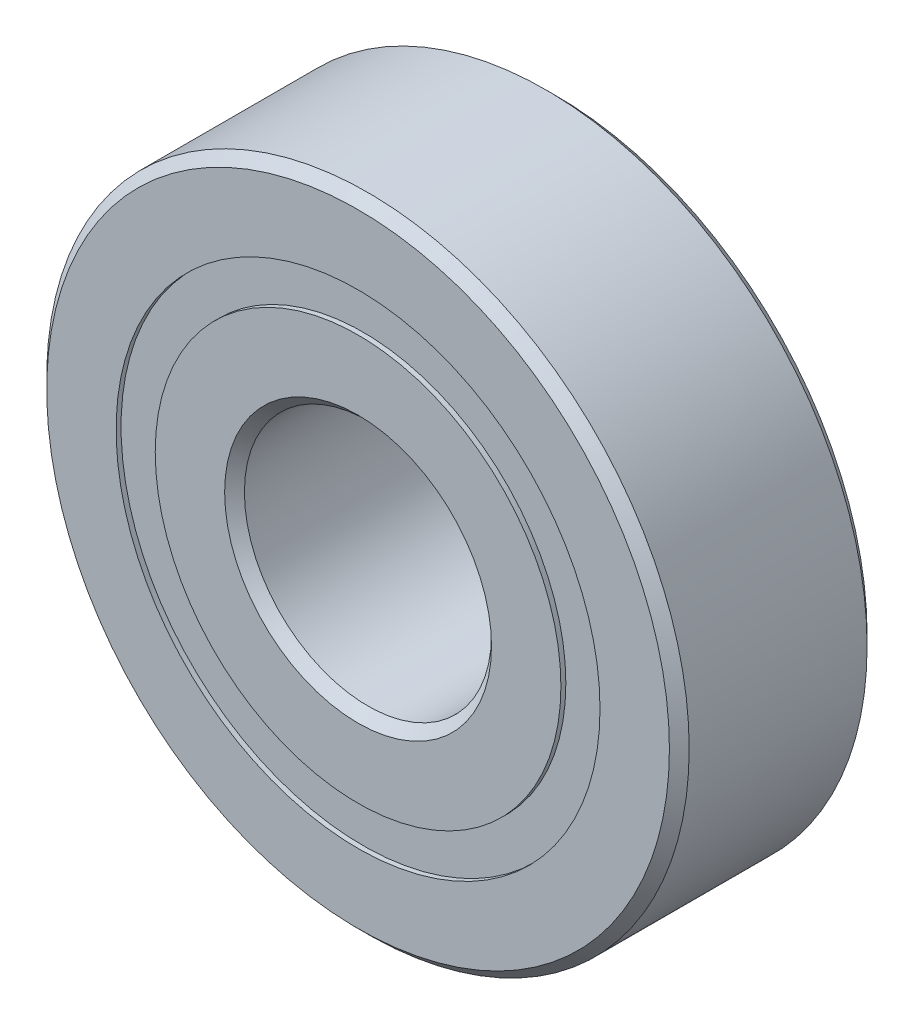
ISO-10303-21;
HEADER;
FILE_DESCRIPTION(('STEP AP214'),'2;1');
FILE_NAME('part.step','',(''),(''),'','','');
FILE_SCHEMA(('AUTOMOTIVE_DESIGN { 1 0 10303 214 1 1 1 1 }'));
ENDSEC;
DATA;
#1=APPLICATION_CONTEXT('core data for automotive mechanical design processes');
#2=APPLICATION_PROTOCOL_DEFINITION('international standard','automotive_design',2000,#1);
#3=PRODUCT_CONTEXT('',#1,'mechanical');
#4=PRODUCT('Part','Part','',(#3));
#5=PRODUCT_RELATED_PRODUCT_CATEGORY('part','',(#4));
#6=PRODUCT_DEFINITION_FORMATION('','',#4);
#7=PRODUCT_DEFINITION_CONTEXT('part definition',#1,'design');
#8=PRODUCT_DEFINITION('design','',#6,#7);
#9=PRODUCT_DEFINITION_SHAPE('','',#8);
#10=(LENGTH_UNIT() NAMED_UNIT(*) SI_UNIT(.MILLI.,.METRE.));
#11=(NAMED_UNIT(*) PLANE_ANGLE_UNIT() SI_UNIT($,.RADIAN.));
#12=(NAMED_UNIT(*) SI_UNIT($,.STERADIAN.) SOLID_ANGLE_UNIT());
#13=UNCERTAINTY_MEASURE_WITH_UNIT(LENGTH_MEASURE(1.E-05),#10,'distance_accuracy_value','');
#14=(GEOMETRIC_REPRESENTATION_CONTEXT(3) GLOBAL_UNCERTAINTY_ASSIGNED_CONTEXT((#13)) GLOBAL_UNIT_ASSIGNED_CONTEXT((#10,
#11,#12)) REPRESENTATION_CONTEXT('',''));
#15=CARTESIAN_POINT('',(0.,0.,0.));
#16=DIRECTION('',(0.,0.,1.));
#17=DIRECTION('',(1.,0.,0.));
#18=AXIS2_PLACEMENT_3D('',#15,#16,#17);
#19=CARTESIAN_POINT('',(0.,9.79120879120879,-3.80000000000003));
#20=DIRECTION('',(0.,0.,1.));
#21=DIRECTION('',(1.,0.,0.));
#22=AXIS2_PLACEMENT_3D('',#19,#20,#21);
#23=PLANE('',#22);
#24=CARTESIAN_POINT('',(0.,0.,-3.80000000000003));
#25=DIRECTION('',(0.,0.,1.));
#26=DIRECTION('',(1.,0.,0.));
#27=AXIS2_PLACEMENT_3D('',#24,#25,#26);
#28=CIRCLE('',#27,9.79120879120879);
#29=CARTESIAN_POINT('',(9.79120879120879,0.,-3.80000000000003));
#30=VERTEX_POINT('',#29);
#31=EDGE_CURVE('E55',#30,#30,#28,.T.);
#32=ORIENTED_EDGE('',*,*,#31,.F.);
#33=EDGE_LOOP('',(#32));
#34=FACE_BOUND('',#33,.T.);
#35=CARTESIAN_POINT('',(0.,0.,-3.80000000000003));
#36=DIRECTION('',(0.,0.,1.));
#37=DIRECTION('',(1.,0.,0.));
#38=AXIS2_PLACEMENT_3D('',#35,#36,#37);
#39=CIRCLE('',#38,8.20879120879121);
#40=CARTESIAN_POINT('',(8.20879120879121,0.,-3.80000000000003));
#41=VERTEX_POINT('',#40);
#42=EDGE_CURVE('E11',#41,#41,#39,.T.);
#43=ORIENTED_EDGE('',*,*,#42,.T.);
#44=EDGE_LOOP('',(#43));
#45=FACE_BOUND('',#44,.T.);
#46=ADVANCED_FACE('F41',(#34,#45),#23,.F.);
#47=CARTESIAN_POINT('',(0.,0.,4.));
#48=DIRECTION('',(0.,0.,1.));
#49=DIRECTION('',(1.,0.,0.));
#50=AXIS2_PLACEMENT_3D('',#47,#48,#49);
#51=CYLINDRICAL_SURFACE('',#50,8.20879120879121);
#52=ORIENTED_EDGE('',*,*,#42,.F.);
#53=EDGE_LOOP('',(#52));
#54=FACE_BOUND('',#53,.T.);
#55=CARTESIAN_POINT('',(0.,0.,-1.9458944417533));
#56=DIRECTION('',(0.,0.,1.));
#57=DIRECTION('',(1.,0.,0.));
#58=AXIS2_PLACEMENT_3D('',#55,#56,#57);
#59=CIRCLE('',#58,8.20879120879121);
#60=CARTESIAN_POINT('',(8.20879120879121,0.,-1.9458944417533));
#61=VERTEX_POINT('',#60);
#62=EDGE_CURVE('E47',#61,#61,#59,.T.);
#63=ORIENTED_EDGE('',*,*,#62,.T.);
#64=EDGE_LOOP('',(#63));
#65=FACE_BOUND('',#64,.T.);
#66=ADVANCED_FACE('F64',(#54,#65),#51,.F.);
#67=CARTESIAN_POINT('',(0.,9.79120879120879,-1.9458944417533));
#68=DIRECTION('',(0.,0.,-1.));
#69=DIRECTION('',(-1.,0.,0.));
#70=AXIS2_PLACEMENT_3D('',#67,#68,#69);
#71=PLANE('',#70);
#72=ORIENTED_EDGE('',*,*,#62,.F.);
#73=EDGE_LOOP('',(#72));
#74=FACE_BOUND('',#73,.T.);
#75=CARTESIAN_POINT('',(0.,0.,-1.9458944417533));
#76=DIRECTION('',(0.,0.,1.));
#77=DIRECTION('',(1.,0.,0.));
#78=AXIS2_PLACEMENT_3D('',#75,#76,#77);
#79=CIRCLE('',#78,9.79120879120879);
#80=CARTESIAN_POINT('',(9.79120879120879,0.,-1.9458944417533));
#81=VERTEX_POINT('',#80);
#82=EDGE_CURVE('E51',#81,#81,#79,.T.);
#83=ORIENTED_EDGE('',*,*,#82,.T.);
#84=EDGE_LOOP('',(#83));
#85=FACE_BOUND('',#84,.T.);
#86=ADVANCED_FACE('F68',(#74,#85),#71,.F.);
#87=CARTESIAN_POINT('',(0.,0.,4.));
#88=DIRECTION('',(0.,0.,1.));
#89=DIRECTION('',(1.,0.,0.));
#90=AXIS2_PLACEMENT_3D('',#87,#88,#89);
#91=CYLINDRICAL_SURFACE('',#90,9.79120879120879);
#92=ORIENTED_EDGE('',*,*,#82,.F.);
#93=EDGE_LOOP('',(#92));
#94=FACE_BOUND('',#93,.T.);
#95=ORIENTED_EDGE('',*,*,#31,.T.);
#96=EDGE_LOOP('',(#95));
#97=FACE_BOUND('',#96,.T.);
#98=ADVANCED_FACE('F61',(#94,#97),#91,.T.);
#99=CLOSED_SHELL('',(#46,#66,#86,#98));
#100=MANIFOLD_SOLID_BREP('B2',#99);
#101=CARTESIAN_POINT('',(0.,9.79120879120877,3.80000000000003));
#102=DIRECTION('',(0.,0.,-1.));
#103=DIRECTION('',(-1.,0.,0.));
#104=AXIS2_PLACEMENT_3D('',#101,#102,#103);
#105=PLANE('',#104);
#106=CARTESIAN_POINT('',(0.,0.,3.80000000000003));
#107=DIRECTION('',(0.,0.,1.));
#108=DIRECTION('',(1.,0.,0.));
#109=AXIS2_PLACEMENT_3D('',#106,#107,#108);
#110=CIRCLE('',#109,8.20879120879121);
#111=CARTESIAN_POINT('',(8.20879120879121,0.,3.80000000000003));
#112=VERTEX_POINT('',#111);
#113=EDGE_CURVE('E40',#112,#112,#110,.T.);
#114=ORIENTED_EDGE('',*,*,#113,.F.);
#115=EDGE_LOOP('',(#114));
#116=FACE_BOUND('',#115,.T.);
#117=CARTESIAN_POINT('',(0.,0.,3.80000000000003));
#118=DIRECTION('',(0.,0.,1.));
#119=DIRECTION('',(1.,0.,0.));
#120=AXIS2_PLACEMENT_3D('',#117,#118,#119);
#121=CIRCLE('',#120,9.79120879120879);
#122=CARTESIAN_POINT('',(9.79120879120879,0.,3.80000000000003));
#123=VERTEX_POINT('',#122);
#124=EDGE_CURVE('E114',#123,#123,#121,.T.);
#125=ORIENTED_EDGE('',*,*,#124,.T.);
#126=EDGE_LOOP('',(#125));
#127=FACE_BOUND('',#126,.T.);
#128=ADVANCED_FACE('F100',(#116,#127),#105,.F.);
#129=CARTESIAN_POINT('',(0.,0.,4.));
#130=DIRECTION('',(0.,0.,1.));
#131=DIRECTION('',(1.,0.,0.));
#132=AXIS2_PLACEMENT_3D('',#129,#130,#131);
#133=CYLINDRICAL_SURFACE('',#132,8.20879120879121);
#134=CARTESIAN_POINT('',(0.,0.,1.9458944417533));
#135=DIRECTION('',(0.,0.,1.));
#136=DIRECTION('',(1.,0.,0.));
#137=AXIS2_PLACEMENT_3D('',#134,#135,#136);
#138=CIRCLE('',#137,8.20879120879121);
#139=CARTESIAN_POINT('',(8.20879120879121,0.,1.9458944417533));
#140=VERTEX_POINT('',#139);
#141=EDGE_CURVE('E106',#140,#140,#138,.T.);
#142=ORIENTED_EDGE('',*,*,#141,.F.);
#143=EDGE_LOOP('',(#142));
#144=FACE_BOUND('',#143,.T.);
#145=ORIENTED_EDGE('',*,*,#113,.T.);
#146=EDGE_LOOP('',(#145));
#147=FACE_BOUND('',#146,.T.);
#148=ADVANCED_FACE('F129',(#144,#147),#133,.F.);
#149=CARTESIAN_POINT('',(0.,9.79120879120879,1.94589444175342));
#150=DIRECTION('',(0.,0.,1.));
#151=DIRECTION('',(1.,0.,0.));
#152=AXIS2_PLACEMENT_3D('',#149,#150,#151);
#153=PLANE('',#152);
#154=CARTESIAN_POINT('',(0.,0.,1.9458944417533));
#155=DIRECTION('',(0.,0.,1.));
#156=DIRECTION('',(1.,0.,0.));
#157=AXIS2_PLACEMENT_3D('',#154,#155,#156);
#158=CIRCLE('',#157,9.79120879120879);
#159=CARTESIAN_POINT('',(9.79120879120879,0.,1.9458944417533));
#160=VERTEX_POINT('',#159);
#161=EDGE_CURVE('E110',#160,#160,#158,.T.);
#162=ORIENTED_EDGE('',*,*,#161,.F.);
#163=EDGE_LOOP('',(#162));
#164=FACE_BOUND('',#163,.T.);
#165=ORIENTED_EDGE('',*,*,#141,.T.);
#166=EDGE_LOOP('',(#165));
#167=FACE_BOUND('',#166,.T.);
#168=ADVANCED_FACE('F124',(#164,#167),#153,.F.);
#169=CARTESIAN_POINT('',(0.,0.,4.));
#170=DIRECTION('',(0.,0.,1.));
#171=DIRECTION('',(1.,0.,0.));
#172=AXIS2_PLACEMENT_3D('',#169,#170,#171);
#173=CYLINDRICAL_SURFACE('',#172,9.79120879120879);
#174=ORIENTED_EDGE('',*,*,#124,.F.);
#175=EDGE_LOOP('',(#174));
#176=FACE_BOUND('',#175,.T.);
#177=ORIENTED_EDGE('',*,*,#161,.T.);
#178=EDGE_LOOP('',(#177));
#179=FACE_BOUND('',#178,.T.);
#180=ADVANCED_FACE('F121',(#176,#179),#173,.T.);
#181=CLOSED_SHELL('',(#128,#148,#168,#180));
#182=MANIFOLD_SOLID_BREP('B6',#181);
#183=CARTESIAN_POINT('',(-3.90495365205792,8.10871981112182,0.));
#184=DIRECTION('',(0.,0.,1.));
#185=DIRECTION('',(-0.433883739117546,0.900968867902425,0.));
#186=AXIS2_PLACEMENT_3D('',#183,#184,#185);
#187=SPHERICAL_SURFACE('',#186,1.94589444175335);
#188=CARTESIAN_POINT('',(-3.90495365205792,8.10871981112182,1.94589444175335));
#189=VERTEX_POINT('',#188);
#190=VERTEX_LOOP('',#189);
#191=FACE_BOUND('',#190,.T.);
#192=ADVANCED_FACE('F159',(#191),#187,.T.);
#193=CLOSED_SHELL('',(#192));
#194=MANIFOLD_SOLID_BREP('B35',#193);
#195=CARTESIAN_POINT('',(-7.0364833422122,5.61140821672869,0.));
#196=DIRECTION('',(0.,0.,1.));
#197=DIRECTION('',(-0.781831482468022,0.623489801858743,0.));
#198=AXIS2_PLACEMENT_3D('',#195,#196,#197);
#199=SPHERICAL_SURFACE('',#198,1.94589444175335);
#200=CARTESIAN_POINT('',(-7.0364833422122,5.61140821672869,1.94589444175335));
#201=VERTEX_POINT('',#200);
#202=VERTEX_LOOP('',#201);
#203=FACE_BOUND('',#202,.T.);
#204=ADVANCED_FACE('F177',(#203),#199,.T.);
#205=CLOSED_SHELL('',(#204));
#206=MANIFOLD_SOLID_BREP('B96',#205);
#207=CARTESIAN_POINT('',(-8.77435120963639,2.00268840560691,0.));
#208=DIRECTION('',(0.,0.,1.));
#209=DIRECTION('',(-0.974927912181822,0.222520933956325,0.));
#210=AXIS2_PLACEMENT_3D('',#207,#208,#209);
#211=SPHERICAL_SURFACE('',#210,1.94589444175335);
#212=CARTESIAN_POINT('',(-8.77435120963639,2.00268840560691,1.94589444175335));
#213=VERTEX_POINT('',#212);
#214=VERTEX_LOOP('',#213);
#215=FACE_BOUND('',#214,.T.);
#216=ADVANCED_FACE('F195',(#215),#211,.T.);
#217=CLOSED_SHELL('',(#216));
#218=MANIFOLD_SOLID_BREP('B155',#217);
#219=CARTESIAN_POINT('',(-8.77435120963644,-2.00268840560675,1.11022302462516E-13));
#220=DIRECTION('',(0.,0.,1.));
#221=DIRECTION('',(-0.974927912181826,-0.222520933956305,0.));
#222=AXIS2_PLACEMENT_3D('',#219,#220,#221);
#223=SPHERICAL_SURFACE('',#222,1.94589444175335);
#224=CARTESIAN_POINT('',(-8.77435120963644,-2.00268840560675,1.94589444175346));
#225=VERTEX_POINT('',#224);
#226=VERTEX_LOOP('',#225);
#227=FACE_BOUND('',#226,.T.);
#228=ADVANCED_FACE('F213',(#227),#223,.T.);
#229=CLOSED_SHELL('',(#228));
#230=MANIFOLD_SOLID_BREP('B173',#229);
#231=CARTESIAN_POINT('',(-7.03648334221232,-5.61140821672855,1.11022302462516E-13));
#232=DIRECTION('',(0.,0.,1.));
#233=DIRECTION('',(-0.781831482468035,-0.623489801858727,0.));
#234=AXIS2_PLACEMENT_3D('',#231,#232,#233);
#235=SPHERICAL_SURFACE('',#234,1.94589444175335);
#236=CARTESIAN_POINT('',(-7.03648334221232,-5.61140821672855,1.94589444175346));
#237=VERTEX_POINT('',#236);
#238=VERTEX_LOOP('',#237);
#239=FACE_BOUND('',#238,.T.);
#240=ADVANCED_FACE('F231',(#239),#235,.T.);
#241=CLOSED_SHELL('',(#240));
#242=MANIFOLD_SOLID_BREP('B191',#241);
#243=CARTESIAN_POINT('',(-3.90495365205809,-8.10871981112175,1.11022302462516E-13));
#244=DIRECTION('',(0.,0.,1.));
#245=DIRECTION('',(-0.433883739117565,-0.900968867902416,0.));
#246=AXIS2_PLACEMENT_3D('',#243,#244,#245);
#247=SPHERICAL_SURFACE('',#246,1.94589444175335);
#248=CARTESIAN_POINT('',(-3.90495365205809,-8.10871981112175,1.94589444175346));
#249=VERTEX_POINT('',#248);
#250=VERTEX_LOOP('',#249);
#251=FACE_BOUND('',#250,.T.);
#252=ADVANCED_FACE('F249',(#251),#247,.T.);
#253=CLOSED_SHELL('',(#252));
#254=MANIFOLD_SOLID_BREP('B209',#253);
#255=CARTESIAN_POINT('',(0.,-9.00000000000001,1.11022302462516E-13));
#256=DIRECTION('',(0.,0.,1.));
#257=DIRECTION('',(0.,-1.,0.));
#258=AXIS2_PLACEMENT_3D('',#255,#256,#257);
#259=SPHERICAL_SURFACE('',#258,1.94589444175335);
#260=CARTESIAN_POINT('',(0.,-9.00000000000001,1.94589444175346));
#261=VERTEX_POINT('',#260);
#262=VERTEX_LOOP('',#261);
#263=FACE_BOUND('',#262,.T.);
#264=ADVANCED_FACE('F267',(#263),#259,.T.);
#265=CLOSED_SHELL('',(#264));
#266=MANIFOLD_SOLID_BREP('B227',#265);
#267=CARTESIAN_POINT('',(3.90495365205797,-8.10871981112181,1.11022302462516E-13));
#268=DIRECTION('',(0.,0.,1.));
#269=DIRECTION('',(0.433883739117553,-0.900968867902422,0.));
#270=AXIS2_PLACEMENT_3D('',#267,#268,#269);
#271=SPHERICAL_SURFACE('',#270,1.94589444175335);
#272=CARTESIAN_POINT('',(3.90495365205797,-8.10871981112181,1.94589444175346));
#273=VERTEX_POINT('',#272);
#274=VERTEX_LOOP('',#273);
#275=FACE_BOUND('',#274,.T.);
#276=ADVANCED_FACE('F285',(#275),#271,.T.);
#277=CLOSED_SHELL('',(#276));
#278=MANIFOLD_SOLID_BREP('B245',#277);
#279=CARTESIAN_POINT('',(7.03648334221224,-5.61140821672864,1.11022302462516E-13));
#280=DIRECTION('',(0.,0.,1.));
#281=DIRECTION('',(0.781831482468027,-0.623489801858737,0.));
#282=AXIS2_PLACEMENT_3D('',#279,#280,#281);
#283=SPHERICAL_SURFACE('',#282,1.94589444175335);
#284=CARTESIAN_POINT('',(7.03648334221224,-5.61140821672864,1.94589444175346));
#285=VERTEX_POINT('',#284);
#286=VERTEX_LOOP('',#285);
#287=FACE_BOUND('',#286,.T.);
#288=ADVANCED_FACE('F303',(#287),#283,.T.);
#289=CLOSED_SHELL('',(#288));
#290=MANIFOLD_SOLID_BREP('B263',#289);
#291=CARTESIAN_POINT('',(8.77435120963641,-2.00268840560687,1.11022302462516E-13));
#292=DIRECTION('',(0.,0.,1.));
#293=DIRECTION('',(0.974927912181823,-0.222520933956318,0.));
#294=AXIS2_PLACEMENT_3D('',#291,#292,#293);
#295=SPHERICAL_SURFACE('',#294,1.94589444175335);
#296=CARTESIAN_POINT('',(8.77435120963641,-2.00268840560687,1.94589444175346));
#297=VERTEX_POINT('',#296);
#298=VERTEX_LOOP('',#297);
#299=FACE_BOUND('',#298,.T.);
#300=ADVANCED_FACE('F321',(#299),#295,.T.);
#301=CLOSED_SHELL('',(#300));
#302=MANIFOLD_SOLID_BREP('B281',#301);
#303=CARTESIAN_POINT('',(8.77435120963642,2.0026884056068,0.));
#304=DIRECTION('',(0.,0.,1.));
#305=DIRECTION('',(0.974927912181825,0.222520933956311,0.));
#306=AXIS2_PLACEMENT_3D('',#303,#304,#305);
#307=SPHERICAL_SURFACE('',#306,1.94589444175335);
#308=CARTESIAN_POINT('',(8.77435120963642,2.0026884056068,1.94589444175335));
#309=VERTEX_POINT('',#308);
#310=VERTEX_LOOP('',#309);
#311=FACE_BOUND('',#310,.T.);
#312=ADVANCED_FACE('F339',(#311),#307,.T.);
#313=CLOSED_SHELL('',(#312));
#314=MANIFOLD_SOLID_BREP('B299',#313);
#315=CARTESIAN_POINT('',(7.03648334221228,5.61140821672858,0.));
#316=DIRECTION('',(0.,0.,1.));
#317=DIRECTION('',(0.781831482468031,0.623489801858732,0.));
#318=AXIS2_PLACEMENT_3D('',#315,#316,#317);
#319=SPHERICAL_SURFACE('',#318,1.94589444175335);
#320=CARTESIAN_POINT('',(7.03648334221228,5.61140821672858,1.94589444175335));
#321=VERTEX_POINT('',#320);
#322=VERTEX_LOOP('',#321);
#323=FACE_BOUND('',#322,.T.);
#324=ADVANCED_FACE('F357',(#323),#319,.T.);
#325=CLOSED_SHELL('',(#324));
#326=MANIFOLD_SOLID_BREP('B317',#325);
#327=CARTESIAN_POINT('',(3.90495365205803,8.10871981112175,0.));
#328=DIRECTION('',(0.,0.,1.));
#329=DIRECTION('',(0.433883739117559,0.900968867902419,0.));
#330=AXIS2_PLACEMENT_3D('',#327,#328,#329);
#331=SPHERICAL_SURFACE('',#330,1.94589444175335);
#332=CARTESIAN_POINT('',(3.90495365205803,8.10871981112175,1.94589444175335));
#333=VERTEX_POINT('',#332);
#334=VERTEX_LOOP('',#333);
#335=FACE_BOUND('',#334,.T.);
#336=ADVANCED_FACE('F375',(#335),#331,.T.);
#337=CLOSED_SHELL('',(#336));
#338=MANIFOLD_SOLID_BREP('B335',#337);
#339=CARTESIAN_POINT('',(0.,8.99999999999999,0.));
#340=DIRECTION('',(0.,0.,1.));
#341=DIRECTION('',(0.,1.,0.));
#342=AXIS2_PLACEMENT_3D('',#339,#340,#341);
#343=SPHERICAL_SURFACE('',#342,1.94589444175335);
#344=CARTESIAN_POINT('',(0.,8.99999999999999,1.94589444175335));
#345=VERTEX_POINT('',#344);
#346=VERTEX_LOOP('',#345);
#347=FACE_BOUND('',#346,.T.);
#348=ADVANCED_FACE('F395',(#347),#343,.T.);
#349=CLOSED_SHELL('',(#348));
#350=MANIFOLD_SOLID_BREP('B353',#349);
#351=CARTESIAN_POINT('',(0.,8.2087912087912,4.));
#352=DIRECTION('',(0.,0.,-1.));
#353=DIRECTION('',(-1.,0.,0.));
#354=AXIS2_PLACEMENT_3D('',#351,#352,#353);
#355=PLANE('',#354);
#356=CARTESIAN_POINT('',(0.,0.,4.));
#357=DIRECTION('',(0.,0.,1.));
#358=DIRECTION('',(1.,0.,0.));
#359=AXIS2_PLACEMENT_3D('',#356,#357,#358);
#360=CIRCLE('',#359,5.4);
#361=CARTESIAN_POINT('',(5.4,0.,4.));
#362=VERTEX_POINT('',#361);
#363=EDGE_CURVE('E440',#362,#362,#360,.T.);
#364=ORIENTED_EDGE('',*,*,#363,.F.);
#365=EDGE_LOOP('',(#364));
#366=FACE_BOUND('',#365,.T.);
#367=CARTESIAN_POINT('',(0.,0.,4.));
#368=DIRECTION('',(0.,0.,1.));
#369=DIRECTION('',(1.,0.,0.));
#370=AXIS2_PLACEMENT_3D('',#367,#368,#369);
#371=CIRCLE('',#370,8.20879120879121);
#372=CARTESIAN_POINT('',(8.20879120879121,0.,4.));
#373=VERTEX_POINT('',#372);
#374=EDGE_CURVE('E394',#373,#373,#371,.T.);
#375=ORIENTED_EDGE('',*,*,#374,.T.);
#376=EDGE_LOOP('',(#375));
#377=FACE_BOUND('',#376,.T.);
#378=ADVANCED_FACE('F412',(#366,#377),#355,.F.);
#379=CARTESIAN_POINT('',(0.,0.,4.));
#380=DIRECTION('',(0.,0.,1.));
#381=DIRECTION('',(1.,0.,0.));
#382=AXIS2_PLACEMENT_3D('',#379,#380,#381);
#383=CYLINDRICAL_SURFACE('',#382,8.20879120879121);
#384=ORIENTED_EDGE('',*,*,#374,.F.);
#385=EDGE_LOOP('',(#384));
#386=FACE_BOUND('',#385,.T.);
#387=CARTESIAN_POINT('',(0.,0.,1.77777777777777));
#388=DIRECTION('',(0.,0.,1.));
#389=DIRECTION('',(1.,0.,0.));
#390=AXIS2_PLACEMENT_3D('',#387,#388,#389);
#391=CIRCLE('',#390,8.20879120879121);
#392=CARTESIAN_POINT('',(8.20879120879121,0.,1.77777777777777));
#393=VERTEX_POINT('',#392);
#394=EDGE_CURVE('E418',#393,#393,#391,.T.);
#395=ORIENTED_EDGE('',*,*,#394,.T.);
#396=EDGE_LOOP('',(#395));
#397=FACE_BOUND('',#396,.T.);
#398=ADVANCED_FACE('F447',(#386,#397),#383,.T.);
#399=CARTESIAN_POINT('',(0.,0.,0.));
#400=DIRECTION('',(0.,0.,1.));
#401=DIRECTION('',(1.,0.,0.));
#402=AXIS2_PLACEMENT_3D('',#399,#400,#401);
#403=TOROIDAL_SURFACE('',#402,8.99999999999999,1.94589444175334);
#404=ORIENTED_EDGE('',*,*,#394,.F.);
#405=EDGE_LOOP('',(#404));
#406=FACE_BOUND('',#405,.T.);
#407=CARTESIAN_POINT('',(0.,0.,-1.77777777777777));
#408=DIRECTION('',(0.,0.,1.));
#409=DIRECTION('',(1.,0.,0.));
#410=AXIS2_PLACEMENT_3D('',#407,#408,#409);
#411=CIRCLE('',#410,8.20879120879121);
#412=CARTESIAN_POINT('',(8.20879120879121,0.,-1.77777777777777));
#413=VERTEX_POINT('',#412);
#414=EDGE_CURVE('E422',#413,#413,#411,.T.);
#415=ORIENTED_EDGE('',*,*,#414,.T.);
#416=EDGE_LOOP('',(#415));
#417=FACE_BOUND('',#416,.T.);
#418=ADVANCED_FACE('F451',(#406,#417),#403,.F.);
#419=CARTESIAN_POINT('',(0.,0.,4.));
#420=DIRECTION('',(0.,0.,1.));
#421=DIRECTION('',(1.,0.,0.));
#422=AXIS2_PLACEMENT_3D('',#419,#420,#421);
#423=CYLINDRICAL_SURFACE('',#422,8.20879120879121);
#424=ORIENTED_EDGE('',*,*,#414,.F.);
#425=EDGE_LOOP('',(#424));
#426=FACE_BOUND('',#425,.T.);
#427=CARTESIAN_POINT('',(0.,0.,-4.));
#428=DIRECTION('',(0.,0.,1.));
#429=DIRECTION('',(1.,0.,0.));
#430=AXIS2_PLACEMENT_3D('',#427,#428,#429);
#431=CIRCLE('',#430,8.20879120879121);
#432=CARTESIAN_POINT('',(8.20879120879121,0.,-4.));
#433=VERTEX_POINT('',#432);
#434=EDGE_CURVE('E426',#433,#433,#431,.T.);
#435=ORIENTED_EDGE('',*,*,#434,.T.);
#436=EDGE_LOOP('',(#435));
#437=FACE_BOUND('',#436,.T.);
#438=ADVANCED_FACE('F456',(#426,#437),#423,.T.);
#439=CARTESIAN_POINT('',(0.,5.39999999999999,-4.));
#440=DIRECTION('',(0.,0.,1.));
#441=DIRECTION('',(1.,0.,0.));
#442=AXIS2_PLACEMENT_3D('',#439,#440,#441);
#443=PLANE('',#442);
#444=ORIENTED_EDGE('',*,*,#434,.F.);
#445=EDGE_LOOP('',(#444));
#446=FACE_BOUND('',#445,.T.);
#447=CARTESIAN_POINT('',(0.,0.,-4.));
#448=DIRECTION('',(0.,0.,1.));
#449=DIRECTION('',(1.,0.,0.));
#450=AXIS2_PLACEMENT_3D('',#447,#448,#449);
#451=CIRCLE('',#450,5.4);
#452=CARTESIAN_POINT('',(5.4,0.,-4.));
#453=VERTEX_POINT('',#452);
#454=EDGE_CURVE('E431',#453,#453,#451,.T.);
#455=ORIENTED_EDGE('',*,*,#454,.T.);
#456=EDGE_LOOP('',(#455));
#457=FACE_BOUND('',#456,.T.);
#458=ADVANCED_FACE('F462',(#446,#457),#443,.F.);
#459=CARTESIAN_POINT('',(0.,0.,-3.60000000000005));
#460=DIRECTION('',(0.,0.,-1.));
#461=DIRECTION('',(-1.,0.,0.));
#462=AXIS2_PLACEMENT_3D('',#459,#460,#461);
#463=CONICAL_SURFACE('',#462,5.,0.785398163397446);
#464=ORIENTED_EDGE('',*,*,#454,.F.);
#465=EDGE_LOOP('',(#464));
#466=FACE_BOUND('',#465,.T.);
#467=CARTESIAN_POINT('',(0.,0.,-3.60000000000005));
#468=DIRECTION('',(0.,0.,1.));
#469=DIRECTION('',(1.,0.,0.));
#470=AXIS2_PLACEMENT_3D('',#467,#468,#469);
#471=CIRCLE('',#470,5.);
#472=CARTESIAN_POINT('',(5.,0.,-3.60000000000005));
#473=VERTEX_POINT('',#472);
#474=EDGE_CURVE('E434',#473,#473,#471,.T.);
#475=ORIENTED_EDGE('',*,*,#474,.T.);
#476=EDGE_LOOP('',(#475));
#477=FACE_BOUND('',#476,.T.);
#478=ADVANCED_FACE('F466',(#466,#477),#463,.F.);
#479=CARTESIAN_POINT('',(0.,0.,4.));
#480=DIRECTION('',(0.,0.,1.));
#481=DIRECTION('',(1.,0.,0.));
#482=AXIS2_PLACEMENT_3D('',#479,#480,#481);
#483=CYLINDRICAL_SURFACE('',#482,5.);
#484=ORIENTED_EDGE('',*,*,#474,.F.);
#485=EDGE_LOOP('',(#484));
#486=FACE_BOUND('',#485,.T.);
#487=CARTESIAN_POINT('',(0.,0.,3.60000000000005));
#488=DIRECTION('',(0.,0.,1.));
#489=DIRECTION('',(1.,0.,0.));
#490=AXIS2_PLACEMENT_3D('',#487,#488,#489);
#491=CIRCLE('',#490,5.);
#492=CARTESIAN_POINT('',(5.,0.,3.60000000000005));
#493=VERTEX_POINT('',#492);
#494=EDGE_CURVE('E437',#493,#493,#491,.T.);
#495=ORIENTED_EDGE('',*,*,#494,.T.);
#496=EDGE_LOOP('',(#495));
#497=FACE_BOUND('',#496,.T.);
#498=ADVANCED_FACE('F470',(#486,#497),#483,.F.);
#499=CARTESIAN_POINT('',(0.,0.,4.));
#500=DIRECTION('',(0.,0.,1.));
#501=DIRECTION('',(1.,0.,0.));
#502=AXIS2_PLACEMENT_3D('',#499,#500,#501);
#503=CONICAL_SURFACE('',#502,5.4,0.785398163397452);
#504=ORIENTED_EDGE('',*,*,#494,.F.);
#505=EDGE_LOOP('',(#504));
#506=FACE_BOUND('',#505,.T.);
#507=ORIENTED_EDGE('',*,*,#363,.T.);
#508=EDGE_LOOP('',(#507));
#509=FACE_BOUND('',#508,.T.);
#510=ADVANCED_FACE('F444',(#506,#509),#503,.F.);
#511=CLOSED_SHELL('',(#378,#398,#418,#438,#458,#478,#498,#510));
#512=MANIFOLD_SOLID_BREP('B371',#511);
#513=CARTESIAN_POINT('',(0.,0.,3.60000000000005));
#514=DIRECTION('',(0.,0.,-1.));
#515=DIRECTION('',(-1.,0.,0.));
#516=AXIS2_PLACEMENT_3D('',#513,#514,#515);
#517=CONICAL_SURFACE('',#516,13.,0.785398163397447);
#518=CARTESIAN_POINT('',(0.,0.,4.));
#519=DIRECTION('',(0.,0.,1.));
#520=DIRECTION('',(1.,0.,0.));
#521=AXIS2_PLACEMENT_3D('',#518,#519,#520);
#522=CIRCLE('',#521,12.6);
#523=CARTESIAN_POINT('',(12.6,0.,4.));
#524=VERTEX_POINT('',#523);
#525=EDGE_CURVE('E545',#524,#524,#522,.T.);
#526=ORIENTED_EDGE('',*,*,#525,.F.);
#527=EDGE_LOOP('',(#526));
#528=FACE_BOUND('',#527,.T.);
#529=CARTESIAN_POINT('',(0.,0.,3.60000000000005));
#530=DIRECTION('',(0.,0.,1.));
#531=DIRECTION('',(1.,0.,0.));
#532=AXIS2_PLACEMENT_3D('',#529,#530,#531);
#533=CIRCLE('',#532,13.);
#534=CARTESIAN_POINT('',(13.,0.,3.60000000000005));
#535=VERTEX_POINT('',#534);
#536=EDGE_CURVE('E411',#535,#535,#533,.T.);
#537=ORIENTED_EDGE('',*,*,#536,.T.);
#538=EDGE_LOOP('',(#537));
#539=FACE_BOUND('',#538,.T.);
#540=ADVANCED_FACE('F517',(#528,#539),#517,.T.);
#541=CARTESIAN_POINT('',(0.,0.,4.));
#542=DIRECTION('',(0.,0.,1.));
#543=DIRECTION('',(1.,0.,0.));
#544=AXIS2_PLACEMENT_3D('',#541,#542,#543);
#545=CYLINDRICAL_SURFACE('',#544,13.);
#546=ORIENTED_EDGE('',*,*,#536,.F.);
#547=EDGE_LOOP('',(#546));
#548=FACE_BOUND('',#547,.T.);
#549=CARTESIAN_POINT('',(0.,0.,-3.60000000000005));
#550=DIRECTION('',(0.,0.,1.));
#551=DIRECTION('',(1.,0.,0.));
#552=AXIS2_PLACEMENT_3D('',#549,#550,#551);
#553=CIRCLE('',#552,13.);
#554=CARTESIAN_POINT('',(13.,0.,-3.60000000000005));
#555=VERTEX_POINT('',#554);
#556=EDGE_CURVE('E523',#555,#555,#553,.T.);
#557=ORIENTED_EDGE('',*,*,#556,.T.);
#558=EDGE_LOOP('',(#557));
#559=FACE_BOUND('',#558,.T.);
#560=ADVANCED_FACE('F552',(#548,#559),#545,.T.);
#561=CARTESIAN_POINT('',(0.,0.,-4.));
#562=DIRECTION('',(0.,0.,1.));
#563=DIRECTION('',(1.,0.,0.));
#564=AXIS2_PLACEMENT_3D('',#561,#562,#563);
#565=CONICAL_SURFACE('',#564,12.6,0.785398163397446);
#566=ORIENTED_EDGE('',*,*,#556,.F.);
#567=EDGE_LOOP('',(#566));
#568=FACE_BOUND('',#567,.T.);
#569=CARTESIAN_POINT('',(0.,0.,-4.));
#570=DIRECTION('',(0.,0.,1.));
#571=DIRECTION('',(1.,0.,0.));
#572=AXIS2_PLACEMENT_3D('',#569,#570,#571);
#573=CIRCLE('',#572,12.6);
#574=CARTESIAN_POINT('',(12.6,0.,-4.));
#575=VERTEX_POINT('',#574);
#576=EDGE_CURVE('E527',#575,#575,#573,.T.);
#577=ORIENTED_EDGE('',*,*,#576,.T.);
#578=EDGE_LOOP('',(#577));
#579=FACE_BOUND('',#578,.T.);
#580=ADVANCED_FACE('F556',(#568,#579),#565,.T.);
#581=CARTESIAN_POINT('',(0.,12.6,-4.));
#582=DIRECTION('',(0.,0.,1.));
#583=DIRECTION('',(1.,0.,0.));
#584=AXIS2_PLACEMENT_3D('',#581,#582,#583);
#585=PLANE('',#584);
#586=ORIENTED_EDGE('',*,*,#576,.F.);
#587=EDGE_LOOP('',(#586));
#588=FACE_BOUND('',#587,.T.);
#589=CARTESIAN_POINT('',(0.,0.,-4.));
#590=DIRECTION('',(0.,0.,1.));
#591=DIRECTION('',(1.,0.,0.));
#592=AXIS2_PLACEMENT_3D('',#589,#590,#591);
#593=CIRCLE('',#592,9.79120879120879);
#594=CARTESIAN_POINT('',(9.79120879120879,0.,-4.));
#595=VERTEX_POINT('',#594);
#596=EDGE_CURVE('E531',#595,#595,#593,.T.);
#597=ORIENTED_EDGE('',*,*,#596,.T.);
#598=EDGE_LOOP('',(#597));
#599=FACE_BOUND('',#598,.T.);
#600=ADVANCED_FACE('F561',(#588,#599),#585,.F.);
#601=CARTESIAN_POINT('',(0.,0.,4.));
#602=DIRECTION('',(0.,0.,1.));
#603=DIRECTION('',(1.,0.,0.));
#604=AXIS2_PLACEMENT_3D('',#601,#602,#603);
#605=CYLINDRICAL_SURFACE('',#604,9.79120879120879);
#606=ORIENTED_EDGE('',*,*,#596,.F.);
#607=EDGE_LOOP('',(#606));
#608=FACE_BOUND('',#607,.T.);
#609=CARTESIAN_POINT('',(0.,0.,-1.77777777777777));
#610=DIRECTION('',(0.,0.,1.));
#611=DIRECTION('',(1.,0.,0.));
#612=AXIS2_PLACEMENT_3D('',#609,#610,#611);
#613=CIRCLE('',#612,9.79120879120879);
#614=CARTESIAN_POINT('',(9.79120879120879,0.,-1.77777777777777));
#615=VERTEX_POINT('',#614);
#616=EDGE_CURVE('E536',#615,#615,#613,.T.);
#617=ORIENTED_EDGE('',*,*,#616,.T.);
#618=EDGE_LOOP('',(#617));
#619=FACE_BOUND('',#618,.T.);
#620=ADVANCED_FACE('F567',(#608,#619),#605,.F.);
#621=CARTESIAN_POINT('',(0.,0.,0.));
#622=DIRECTION('',(0.,0.,1.));
#623=DIRECTION('',(1.,0.,0.));
#624=AXIS2_PLACEMENT_3D('',#621,#622,#623);
#625=TOROIDAL_SURFACE('',#624,9.,1.94589444175335);
#626=ORIENTED_EDGE('',*,*,#616,.F.);
#627=EDGE_LOOP('',(#626));
#628=FACE_BOUND('',#627,.T.);
#629=CARTESIAN_POINT('',(0.,0.,1.77777777777777));
#630=DIRECTION('',(0.,0.,1.));
#631=DIRECTION('',(1.,0.,0.));
#632=AXIS2_PLACEMENT_3D('',#629,#630,#631);
#633=CIRCLE('',#632,9.79120879120879);
#634=CARTESIAN_POINT('',(9.79120879120879,0.,1.77777777777777));
#635=VERTEX_POINT('',#634);
#636=EDGE_CURVE('E539',#635,#635,#633,.T.);
#637=ORIENTED_EDGE('',*,*,#636,.T.);
#638=EDGE_LOOP('',(#637));
#639=FACE_BOUND('',#638,.T.);
#640=ADVANCED_FACE('F571',(#628,#639),#625,.F.);
#641=CARTESIAN_POINT('',(0.,0.,4.));
#642=DIRECTION('',(0.,0.,1.));
#643=DIRECTION('',(1.,0.,0.));
#644=AXIS2_PLACEMENT_3D('',#641,#642,#643);
#645=CYLINDRICAL_SURFACE('',#644,9.79120879120879);
#646=ORIENTED_EDGE('',*,*,#636,.F.);
#647=EDGE_LOOP('',(#646));
#648=FACE_BOUND('',#647,.T.);
#649=CARTESIAN_POINT('',(0.,0.,4.));
#650=DIRECTION('',(0.,0.,1.));
#651=DIRECTION('',(1.,0.,0.));
#652=AXIS2_PLACEMENT_3D('',#649,#650,#651);
#653=CIRCLE('',#652,9.79120879120879);
#654=CARTESIAN_POINT('',(9.79120879120879,0.,4.));
#655=VERTEX_POINT('',#654);
#656=EDGE_CURVE('E542',#655,#655,#653,.T.);
#657=ORIENTED_EDGE('',*,*,#656,.T.);
#658=EDGE_LOOP('',(#657));
#659=FACE_BOUND('',#658,.T.);
#660=ADVANCED_FACE('F575',(#648,#659),#645,.F.);
#661=CARTESIAN_POINT('',(0.,12.6,4.));
#662=DIRECTION('',(0.,0.,-1.));
#663=DIRECTION('',(-1.,0.,0.));
#664=AXIS2_PLACEMENT_3D('',#661,#662,#663);
#665=PLANE('',#664);
#666=ORIENTED_EDGE('',*,*,#656,.F.);
#667=EDGE_LOOP('',(#666));
#668=FACE_BOUND('',#667,.T.);
#669=ORIENTED_EDGE('',*,*,#525,.T.);
#670=EDGE_LOOP('',(#669));
#671=FACE_BOUND('',#670,.T.);
#672=ADVANCED_FACE('F549',(#668,#671),#665,.F.);
#673=CLOSED_SHELL('',(#540,#560,#580,#600,#620,#640,#660,#672));
#674=MANIFOLD_SOLID_BREP('B389',#673);
#675=ADVANCED_BREP_SHAPE_REPRESENTATION('',(#18,#100,#182,#194,#206,#218,#230,#242,#254,#266,
#278,#290,#302,#314,#326,#338,#350,#512,#674),#14);
#676=SHAPE_DEFINITION_REPRESENTATION(#9,#675);
ENDSEC;
END-ISO-10303-21;
